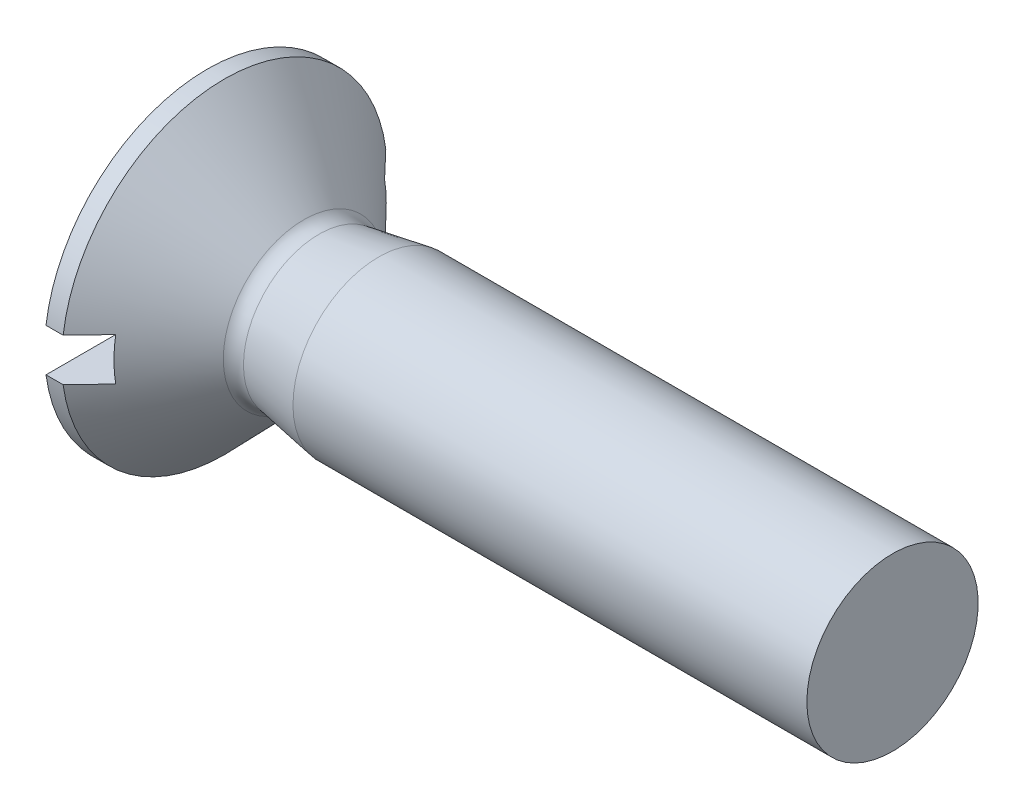
ISO-10303-21;
HEADER;
FILE_DESCRIPTION(('STEP AP214'),'2;1');
FILE_NAME('part.step','',(''),(''),'','','');
FILE_SCHEMA(('AUTOMOTIVE_DESIGN { 1 0 10303 214 1 1 1 1 }'));
ENDSEC;
DATA;
#1=APPLICATION_CONTEXT('core data for automotive mechanical design processes');
#2=APPLICATION_PROTOCOL_DEFINITION('international standard','automotive_design',2000,#1);
#3=PRODUCT_CONTEXT('',#1,'mechanical');
#4=PRODUCT('Part','Part','',(#3));
#5=PRODUCT_RELATED_PRODUCT_CATEGORY('part','',(#4));
#6=PRODUCT_DEFINITION_FORMATION('','',#4);
#7=PRODUCT_DEFINITION_CONTEXT('part definition',#1,'design');
#8=PRODUCT_DEFINITION('design','',#6,#7);
#9=PRODUCT_DEFINITION_SHAPE('','',#8);
#10=(LENGTH_UNIT() NAMED_UNIT(*) SI_UNIT(.MILLI.,.METRE.));
#11=(NAMED_UNIT(*) PLANE_ANGLE_UNIT() SI_UNIT($,.RADIAN.));
#12=(NAMED_UNIT(*) SI_UNIT($,.STERADIAN.) SOLID_ANGLE_UNIT());
#13=UNCERTAINTY_MEASURE_WITH_UNIT(LENGTH_MEASURE(1.E-05),#10,'distance_accuracy_value','');
#14=(GEOMETRIC_REPRESENTATION_CONTEXT(3) GLOBAL_UNCERTAINTY_ASSIGNED_CONTEXT((#13)) GLOBAL_UNIT_ASSIGNED_CONTEXT((#10,
#11,#12)) REPRESENTATION_CONTEXT('',''));
#15=CARTESIAN_POINT('',(0.,0.,0.));
#16=DIRECTION('',(0.,0.,1.));
#17=DIRECTION('',(1.,0.,0.));
#18=AXIS2_PLACEMENT_3D('',#15,#16,#17);
#19=CARTESIAN_POINT('',(0.,0.,0.));
#20=DIRECTION('',(-1.,0.,0.));
#21=DIRECTION('',(0.,0.,1.));
#22=AXIS2_PLACEMENT_3D('',#19,#20,#21);
#23=CYLINDRICAL_SURFACE('',#22,1.9);
#24=CARTESIAN_POINT('',(0.2,0.,0.));
#25=DIRECTION('',(-1.,0.,0.));
#26=DIRECTION('',(0.,0.,1.));
#27=AXIS2_PLACEMENT_3D('',#24,#25,#26);
#28=CIRCLE('',#27,1.9);
#29=CARTESIAN_POINT('',(0.2,-0.249999999999999,-1.88348082018374));
#30=VERTEX_POINT('',#29);
#31=CARTESIAN_POINT('',(0.2,-0.249999999999999,1.88348082018374));
#32=VERTEX_POINT('',#31);
#33=EDGE_CURVE('E105',#30,#32,#28,.T.);
#34=ORIENTED_EDGE('',*,*,#33,.T.);
#35=DIRECTION('',(-1.,0.,0.));
#36=VECTOR('',#35,1.);
#37=CARTESIAN_POINT('',(0.,-0.249999999999999,1.88348082018374));
#38=LINE('',#37,#36);
#39=CARTESIAN_POINT('',(0.,-0.249999999999999,1.88348082018374));
#40=VERTEX_POINT('',#39);
#41=EDGE_CURVE('E106',#32,#40,#38,.T.);
#42=ORIENTED_EDGE('',*,*,#41,.T.);
#43=CARTESIAN_POINT('',(0.,0.,0.));
#44=DIRECTION('',(-1.,0.,0.));
#45=DIRECTION('',(0.,0.,1.));
#46=AXIS2_PLACEMENT_3D('',#43,#44,#45);
#47=CIRCLE('',#46,1.9);
#48=CARTESIAN_POINT('',(0.,-0.249999999999999,-1.88348082018374));
#49=VERTEX_POINT('',#48);
#50=EDGE_CURVE('E167',#49,#40,#47,.T.);
#51=ORIENTED_EDGE('',*,*,#50,.F.);
#52=DIRECTION('',(-1.,0.,0.));
#53=VECTOR('',#52,1.);
#54=CARTESIAN_POINT('',(0.,-0.249999999999999,-1.88348082018374));
#55=LINE('',#54,#53);
#56=EDGE_CURVE('E50',#49,#30,#55,.F.);
#57=ORIENTED_EDGE('',*,*,#56,.T.);
#58=EDGE_LOOP('',(#34,#42,#51,#57));
#59=FACE_BOUND('',#58,.T.);
#60=ADVANCED_FACE('F35',(#59),#23,.T.);
#61=CARTESIAN_POINT('',(0.,0.,0.));
#62=DIRECTION('',(1.,0.,0.));
#63=DIRECTION('',(0.,0.,-1.));
#64=AXIS2_PLACEMENT_3D('',#61,#62,#63);
#65=PLANE('',#64);
#66=CARTESIAN_POINT('',(0.,0.25,1.88348082018374));
#67=VERTEX_POINT('',#66);
#68=CARTESIAN_POINT('',(0.,0.25,-1.88348082018374));
#69=VERTEX_POINT('',#68);
#70=EDGE_CURVE('E163',#67,#69,#47,.T.);
#71=ORIENTED_EDGE('',*,*,#70,.T.);
#72=DIRECTION('',(0.,0.,1.));
#73=VECTOR('',#72,1.);
#74=CARTESIAN_POINT('',(0.,0.25,0.));
#75=LINE('',#74,#73);
#76=EDGE_CURVE('E181',#69,#67,#75,.T.);
#77=ORIENTED_EDGE('',*,*,#76,.T.);
#78=EDGE_LOOP('',(#71,#77));
#79=FACE_BOUND('',#78,.T.);
#80=ADVANCED_FACE('F148',(#79),#65,.F.);
#81=CARTESIAN_POINT('',(8.,1.,0.));
#82=DIRECTION('',(-1.,0.,0.));
#83=DIRECTION('',(0.,0.,1.));
#84=AXIS2_PLACEMENT_3D('',#81,#82,#83);
#85=PLANE('',#84);
#86=CARTESIAN_POINT('',(8.,0.,0.));
#87=DIRECTION('',(-1.,0.,0.));
#88=DIRECTION('',(0.,0.,1.));
#89=AXIS2_PLACEMENT_3D('',#86,#87,#88);
#90=CIRCLE('',#89,1.);
#91=CARTESIAN_POINT('',(8.,0.,1.));
#92=VERTEX_POINT('',#91);
#93=EDGE_CURVE('E177',#92,#92,#90,.T.);
#94=ORIENTED_EDGE('',*,*,#93,.F.);
#95=EDGE_LOOP('',(#94));
#96=FACE_BOUND('',#95,.T.);
#97=ADVANCED_FACE('F37',(#96),#85,.F.);
#98=CARTESIAN_POINT('',(0.,0.,0.));
#99=DIRECTION('',(-1.,0.,0.));
#100=DIRECTION('',(0.,0.,1.));
#101=AXIS2_PLACEMENT_3D('',#98,#99,#100);
#102=CYLINDRICAL_SURFACE('',#101,1.);
#103=CARTESIAN_POINT('',(2.,0.,0.));
#104=DIRECTION('',(-1.,0.,0.));
#105=DIRECTION('',(0.,0.,1.));
#106=AXIS2_PLACEMENT_3D('',#103,#104,#105);
#107=CIRCLE('',#106,1.);
#108=CARTESIAN_POINT('',(2.,0.,1.));
#109=VERTEX_POINT('',#108);
#110=EDGE_CURVE('E174',#109,#109,#107,.T.);
#111=ORIENTED_EDGE('',*,*,#110,.F.);
#112=EDGE_LOOP('',(#111));
#113=FACE_BOUND('',#112,.T.);
#114=ORIENTED_EDGE('',*,*,#93,.T.);
#115=EDGE_LOOP('',(#114));
#116=FACE_BOUND('',#115,.T.);
#117=ADVANCED_FACE('F186',(#113,#116),#102,.T.);
#118=CARTESIAN_POINT('',(2.,0.,0.));
#119=DIRECTION('',(1.,0.,0.));
#120=DIRECTION('',(0.,0.,-1.));
#121=AXIS2_PLACEMENT_3D('',#118,#119,#120);
#122=CONICAL_SURFACE('',#121,1.,0.167819484919047);
#123=CARTESIAN_POINT('',(1.30400038848807,0.,0.));
#124=DIRECTION('',(-1.,0.,0.));
#125=DIRECTION('',(0.,0.,1.));
#126=AXIS2_PLACEMENT_3D('',#123,#124,#125);
#127=CIRCLE('',#126,0.882088692817089);
#128=CARTESIAN_POINT('',(1.30400038848807,0.,0.882088692817089));
#129=VERTEX_POINT('',#128);
#130=EDGE_CURVE('E171',#129,#129,#127,.T.);
#131=ORIENTED_EDGE('',*,*,#130,.F.);
#132=EDGE_LOOP('',(#131));
#133=FACE_BOUND('',#132,.T.);
#134=ORIENTED_EDGE('',*,*,#110,.T.);
#135=EDGE_LOOP('',(#134));
#136=FACE_BOUND('',#135,.T.);
#137=ADVANCED_FACE('F192',(#133,#136),#122,.T.);
#138=CARTESIAN_POINT('',(1.27059381526381,0.,0.));
#139=DIRECTION('',(-1.,0.,0.));
#140=DIRECTION('',(0.,0.,1.));
#141=AXIS2_PLACEMENT_3D('',#138,#139,#140);
#142=TOROIDAL_SURFACE('',#141,1.07927895846277,0.2);
#143=CARTESIAN_POINT('',(1.12672585519608,0.,0.));
#144=DIRECTION('',(-1.,0.,0.));
#145=DIRECTION('',(0.,0.,1.));
#146=AXIS2_PLACEMENT_3D('',#143,#144,#145);
#147=CIRCLE('',#146,0.940347284370966);
#148=CARTESIAN_POINT('',(1.12672585519608,0.,0.940347284370966));
#149=VERTEX_POINT('',#148);
#150=EDGE_CURVE('E165',#149,#149,#147,.T.);
#151=ORIENTED_EDGE('',*,*,#150,.F.);
#152=EDGE_LOOP('',(#151));
#153=FACE_BOUND('',#152,.T.);
#154=ORIENTED_EDGE('',*,*,#130,.T.);
#155=EDGE_LOOP('',(#154));
#156=FACE_BOUND('',#155,.T.);
#157=ADVANCED_FACE('F153',(#153,#156),#142,.F.);
#158=CARTESIAN_POINT('',(1.12672585519608,0.,0.));
#159=DIRECTION('',(-1.,0.,0.));
#160=DIRECTION('',(0.,0.,1.));
#161=AXIS2_PLACEMENT_3D('',#158,#159,#160);
#162=CONICAL_SURFACE('',#161,0.940347284370966,0.802851455917393);
#163=CARTESIAN_POINT('',(0.5,0.,0.));
#164=DIRECTION('',(1.,0.,0.));
#165=DIRECTION('',(0.,1.,0.));
#166=AXIS2_PLACEMENT_3D('',#163,#164,#165);
#167=CIRCLE('',#166,1.58934090586283);
#168=CARTESIAN_POINT('',(0.499999999999999,-0.249999999999999,-1.56955551512168));
#169=VERTEX_POINT('',#168);
#170=CARTESIAN_POINT('',(0.5,0.25,-1.56955551512168));
#171=VERTEX_POINT('',#170);
#172=EDGE_CURVE('E11',#169,#171,#167,.T.);
#173=ORIENTED_EDGE('',*,*,#172,.T.);
#174=CARTESIAN_POINT('',(-2.01601493470514,0.25,4.18729422630551));
#175=CARTESIAN_POINT('',(-1.87664923813912,0.25,4.04271769435418));
#176=CARTESIAN_POINT('',(-1.73729482345771,0.25,3.89813027800257));
#177=CARTESIAN_POINT('',(-1.45862095611518,0.25,3.6089169222469));
#178=CARTESIAN_POINT('',(-1.31930150410232,0.25,3.46429098221823));
#179=CARTESIAN_POINT('',(-1.04066177400944,0.25,3.17493377785335));
#180=CARTESIAN_POINT('',(-0.901341515801131,0.25,3.03020249438092));
#181=CARTESIAN_POINT('',(-0.622782490908927,0.25,2.74066622374668));
#182=CARTESIAN_POINT('',(-0.483543722883639,0.25,2.59586123787586));
#183=CARTESIAN_POINT('',(-0.201786956770368,0.25,2.30257938996187));
#184=CARTESIAN_POINT('',(-0.0592721606083867,0.25,2.15409945232285));
#185=CARTESIAN_POINT('',(0.225528245293348,0.25,1.85690533383418));
#186=CARTESIAN_POINT('',(0.367813843219135,0.25,1.70819114164504));
#187=CARTESIAN_POINT('',(0.580840870368113,0.25,1.48477213973957));
#188=CARTESIAN_POINT('',(0.651774267846905,0.25,1.41025039178459));
#189=CARTESIAN_POINT('',(0.793437145184127,0.25,1.26100995422566));
#190=CARTESIAN_POINT('',(0.864166620773327,0.25,1.18629126056032));
#191=CARTESIAN_POINT('',(1.00526448587424,0.25,1.03652726934552));
#192=CARTESIAN_POINT('',(1.0756329084935,0.25,0.961482002951812));
#193=CARTESIAN_POINT('',(1.21571782760126,0.25,0.810786132033253));
#194=CARTESIAN_POINT('',(1.28543435354055,0.25,0.735135555143891));
#195=CARTESIAN_POINT('',(1.37201750361893,0.25,0.639224449765212));
#196=CARTESIAN_POINT('',(1.3896160368168,0.25,0.619626583408543));
#197=CARTESIAN_POINT('',(1.4246691063127,0.25,0.580302510321601));
#198=CARTESIAN_POINT('',(1.44212364034506,0.25,0.560576301580701));
#199=CARTESIAN_POINT('',(1.49415371529718,0.25,0.501229712885388));
#200=CARTESIAN_POINT('',(1.52846095809073,0.25,0.461369657393176));
#201=CARTESIAN_POINT('',(1.58507933062902,0.25,0.393169607703334));
#202=CARTESIAN_POINT('',(1.6077717062677,0.25,0.365146567609488));
#203=CARTESIAN_POINT('',(1.65204449781809,0.25,0.308059026538506));
#204=CARTESIAN_POINT('',(1.67362100490673,0.25,0.278991399183496));
#205=CARTESIAN_POINT('',(1.71123114196319,0.25,0.22382616683357));
#206=CARTESIAN_POINT('',(1.7276061907623,0.25,0.197963111679399));
#207=CARTESIAN_POINT('',(1.75686731149356,0.25,0.144317811970711));
#208=CARTESIAN_POINT('',(1.7697727012953,0.25,0.116547322101303));
#209=CARTESIAN_POINT('',(1.78402855567211,0.25,0.0717983577731039));
#210=CARTESIAN_POINT('',(1.78796430954531,0.25,0.0556898048400385));
#211=CARTESIAN_POINT('',(1.79285666778232,0.25,0.0230595466848579));
#212=CARTESIAN_POINT('',(1.79382503824804,0.25,0.00653973572952782));
#213=CARTESIAN_POINT('',(1.79256779412007,0.25,-0.0263838004625423));
#214=CARTESIAN_POINT('',(1.79033915987774,0.25,-0.0427874012241021));
#215=CARTESIAN_POINT('',(1.78320931283225,0.25,-0.0750341288284093));
#216=CARTESIAN_POINT('',(1.77829704417356,0.25,-0.0908746463961853));
#217=CARTESIAN_POINT('',(1.76508659022058,0.25,-0.125837594435742));
#218=CARTESIAN_POINT('',(1.75624048953288,0.25,-0.144744602097832));
#219=CARTESIAN_POINT('',(1.73676775330008,0.25,-0.181635353658967));
#220=CARTESIAN_POINT('',(1.7261367353416,0.25,-0.199616679221351));
#221=CARTESIAN_POINT('',(1.70370123401058,0.25,-0.235033462765642));
#222=CARTESIAN_POINT('',(1.69188762334596,0.25,-0.252463049377781));
#223=CARTESIAN_POINT('',(1.66757081663527,0.25,-0.286795734849196));
#224=CARTESIAN_POINT('',(1.65506848487411,0.25,-0.303699453722596));
#225=CARTESIAN_POINT('',(1.61333324317185,0.25,-0.358538111769461));
#226=CARTESIAN_POINT('',(1.58314156582687,0.25,-0.395737930365852));
#227=CARTESIAN_POINT('',(1.5216698640317,0.25,-0.469231644734777));
#228=CARTESIAN_POINT('',(1.49038935658736,0.25,-0.505525125882915));
#229=CARTESIAN_POINT('',(1.42717306094644,0.25,-0.577627630223686));
#230=CARTESIAN_POINT('',(1.39523641414764,0.25,-0.613435901438079));
#231=CARTESIAN_POINT('',(1.33100167337737,0.25,-0.684711577002231));
#232=CARTESIAN_POINT('',(1.29870365403241,0.25,-0.720179049017128));
#233=CARTESIAN_POINT('',(1.20187883299638,0.25,-0.825799529881122));
#234=CARTESIAN_POINT('',(1.13700638296127,0.25,-0.895635369316581));
#235=CARTESIAN_POINT('',(1.00686288225263,0.25,-1.03483505375393));
#236=CARTESIAN_POINT('',(0.941592163859256,0.25,-1.10419921112329));
#237=CARTESIAN_POINT('',(0.757331369017412,0.25,-1.29930120353699));
#238=CARTESIAN_POINT('',(0.638050216922742,0.25,-1.4247640699768));
#239=CARTESIAN_POINT('',(0.399132142423295,0.25,-1.67535206962172));
#240=CARTESIAN_POINT('',(0.279495216130276,0.25,-1.800477199107));
#241=CARTESIAN_POINT('',(0.039982480864666,0.25,-2.05058314132827));
#242=CARTESIAN_POINT('',(-0.0798933973540164,0.25,-2.17556388778698));
#243=CARTESIAN_POINT('',(-0.319760521210998,0.25,-2.42541358736704));
#244=CARTESIAN_POINT('',(-0.439751766391554,0.25,-2.5502825409282));
#245=CARTESIAN_POINT('',(-0.802330817180014,0.25,-2.92738586690317));
#246=CARTESIAN_POINT('',(-1.04502811394854,0.25,-3.1795149529747));
#247=CARTESIAN_POINT('',(-1.53048563082897,0.25,-3.68353034814328));
#248=CARTESIAN_POINT('',(-1.77324579322125,0.25,-3.93541671282475));
#249=CARTESIAN_POINT('',(-2.01601493470514,0.25,-4.18729422630551));
#250=B_SPLINE_CURVE_WITH_KNOTS('',3,(#174,#175,#176,#177,#178,#179,#180,#181,#182,#183,#184,
#185,#186,#187,#188,#189,#190,#191,#192,#193,#194,#195,#196,#197,#198,#199,#200,#201,#202,#203,
#204,#205,#206,#207,#208,#209,#210,#211,#212,#213,#214,#215,#216,#217,#218,#219,#220,#221,#222,
#223,#224,#225,#226,#227,#228,#229,#230,#231,#232,#233,#234,#235,#236,#237,#238,#239,#240,#241,
#242,#243,#244,#245,#246,#247,#248,#249),.UNSPECIFIED.,.F.,.F.,(4,2,2,2,2,2,2,2,2,2,2,2,2,2,2,2,
2,2,2,2,2,2,2,2,2,2,2,2,2,2,2,2,2,2,2,2,2,4),(0.,0.602433856000322,1.20487816004374,
1.80755178193664,2.4102151874483,3.02763789002436,3.64509145957526,3.95374218183071,
4.26239931962769,4.57102762963268,4.87964192868944,4.95866046545058,5.0376802431197,
5.19542898182686,5.30359549595027,5.41211829389888,5.50388214281981,5.5951239734863,
5.64465557396231,5.69399051870495,5.74337209219491,5.79295865572406,5.85541669420085,
5.91803038729474,5.98117131376421,6.04423473310871,6.18790584613683,6.33164152340159,
6.47557906854842,6.61948741872571,6.9054352760994,7.19117049681672,7.71051404804738,
8.22986329617977,8.74939529776958,9.26892524644334,10.3188010616788,11.3682831989146),.UNSPECIFIED.);
#251=CARTESIAN_POINT('',(0.2,0.25,-1.88348082018374));
#252=VERTEX_POINT('',#251);
#253=EDGE_CURVE('E126',#171,#252,#250,.T.);
#254=ORIENTED_EDGE('',*,*,#253,.T.);
#255=CARTESIAN_POINT('',(0.2,0.25,1.88348082018374));
#256=VERTEX_POINT('',#255);
#257=EDGE_CURVE('E162',#256,#252,#28,.T.);
#258=ORIENTED_EDGE('',*,*,#257,.F.);
#259=CARTESIAN_POINT('',(0.5,0.25,1.56955551512168));
#260=VERTEX_POINT('',#259);
#261=EDGE_CURVE('E118',#256,#260,#250,.T.);
#262=ORIENTED_EDGE('',*,*,#261,.T.);
#263=CARTESIAN_POINT('',(0.499999999999999,-0.249999999999999,1.56955551512168));
#264=VERTEX_POINT('',#263);
#265=EDGE_CURVE('E39',#260,#264,#167,.T.);
#266=ORIENTED_EDGE('',*,*,#265,.T.);
#267=CARTESIAN_POINT('',(-2.01601493470514,-0.249999999999999,-4.18729422630551));
#268=CARTESIAN_POINT('',(-1.87664923813912,-0.249999999999999,-4.04271769435418));
#269=CARTESIAN_POINT('',(-1.73729482345771,-0.249999999999999,-3.89813027800256));
#270=CARTESIAN_POINT('',(-1.45862095611517,-0.249999999999999,-3.60891692224689));
#271=CARTESIAN_POINT('',(-1.31930150410231,-0.249999999999999,-3.46429098221822));
#272=CARTESIAN_POINT('',(-1.04066177400943,-0.249999999999999,-3.17493377785335));
#273=CARTESIAN_POINT('',(-0.901341515801126,-0.249999999999999,-3.03020249438091));
#274=CARTESIAN_POINT('',(-0.622782490908921,-0.249999999999999,-2.74066622374667));
#275=CARTESIAN_POINT('',(-0.483543722883633,-0.249999999999999,-2.59586123787585));
#276=CARTESIAN_POINT('',(-0.201786956770361,-0.249999999999999,-2.30257938996186));
#277=CARTESIAN_POINT('',(-0.0592721606083805,-0.249999999999999,-2.15409945232285));
#278=CARTESIAN_POINT('',(0.225528245293354,-0.249999999999999,-1.85690533383417));
#279=CARTESIAN_POINT('',(0.36781384321914,-0.249999999999999,-1.70819114164503));
#280=CARTESIAN_POINT('',(0.580840870368117,-0.249999999999999,-1.48477213973956));
#281=CARTESIAN_POINT('',(0.651774267846908,-0.249999999999999,-1.41025039178459));
#282=CARTESIAN_POINT('',(0.79343714518413,-0.249999999999999,-1.26100995422566));
#283=CARTESIAN_POINT('',(0.864166620773329,-0.249999999999999,-1.18629126056031));
#284=CARTESIAN_POINT('',(1.00526448587424,-0.249999999999999,-1.03652726934552));
#285=CARTESIAN_POINT('',(1.0756329084935,-0.249999999999999,-0.96148200295181));
#286=CARTESIAN_POINT('',(1.21571782760126,-0.249999999999999,-0.810786132033252));
#287=CARTESIAN_POINT('',(1.28543435354056,-0.249999999999999,-0.735135555143891));
#288=CARTESIAN_POINT('',(1.37201750361893,-0.249999999999999,-0.639224449765212));
#289=CARTESIAN_POINT('',(1.3896160368168,-0.249999999999999,-0.619626583408544));
#290=CARTESIAN_POINT('',(1.4246691063127,-0.249999999999999,-0.580302510321601));
#291=CARTESIAN_POINT('',(1.44212364034506,-0.249999999999999,-0.560576301580701));
#292=CARTESIAN_POINT('',(1.49415371529718,-0.249999999999999,-0.501229712885388));
#293=CARTESIAN_POINT('',(1.52846095809073,-0.249999999999999,-0.461369657393176));
#294=CARTESIAN_POINT('',(1.58507933062902,-0.249999999999999,-0.393169607703335));
#295=CARTESIAN_POINT('',(1.6077717062677,-0.249999999999999,-0.365146567609488));
#296=CARTESIAN_POINT('',(1.65204449781809,-0.249999999999999,-0.308059026538507));
#297=CARTESIAN_POINT('',(1.67362100490673,-0.249999999999999,-0.278991399183497));
#298=CARTESIAN_POINT('',(1.71123114196319,-0.249999999999999,-0.223826166833571));
#299=CARTESIAN_POINT('',(1.7276061907623,-0.249999999999999,-0.1979631116794));
#300=CARTESIAN_POINT('',(1.75686731149356,-0.249999999999999,-0.144317811970711));
#301=CARTESIAN_POINT('',(1.7697727012953,-0.249999999999999,-0.116547322101302));
#302=CARTESIAN_POINT('',(1.78402855567211,-0.249999999999999,-0.0717983577731018));
#303=CARTESIAN_POINT('',(1.78796430954531,-0.249999999999999,-0.0556898048400362));
#304=CARTESIAN_POINT('',(1.79285666778232,-0.249999999999999,-0.0230595466848554));
#305=CARTESIAN_POINT('',(1.79382503824804,-0.249999999999999,-0.00653973572952537));
#306=CARTESIAN_POINT('',(1.79256779412007,-0.249999999999999,0.0263838004625447));
#307=CARTESIAN_POINT('',(1.79033915987774,-0.249999999999999,0.0427874012241046));
#308=CARTESIAN_POINT('',(1.78320931283225,-0.249999999999999,0.0750341288284119));
#309=CARTESIAN_POINT('',(1.77829704417356,-0.249999999999999,0.0908746463961878));
#310=CARTESIAN_POINT('',(1.76508659022058,-0.249999999999999,0.125837594435745));
#311=CARTESIAN_POINT('',(1.75624048953288,-0.249999999999999,0.144744602097835));
#312=CARTESIAN_POINT('',(1.73676775330008,-0.249999999999999,0.181635353658971));
#313=CARTESIAN_POINT('',(1.7261367353416,-0.249999999999999,0.199616679221356));
#314=CARTESIAN_POINT('',(1.70370123401058,-0.249999999999999,0.235033462765648));
#315=CARTESIAN_POINT('',(1.69188762334596,-0.249999999999999,0.252463049377787));
#316=CARTESIAN_POINT('',(1.66757081663526,-0.249999999999999,0.286795734849203));
#317=CARTESIAN_POINT('',(1.65506848487411,-0.249999999999999,0.303699453722604));
#318=CARTESIAN_POINT('',(1.61333324317184,-0.249999999999999,0.35853811176947));
#319=CARTESIAN_POINT('',(1.58314156582686,-0.249999999999999,0.395737930365863));
#320=CARTESIAN_POINT('',(1.52166986403169,-0.249999999999999,0.46923164473479));
#321=CARTESIAN_POINT('',(1.49038935658735,-0.249999999999999,0.505525125882929));
#322=CARTESIAN_POINT('',(1.42717306094642,-0.249999999999999,0.577627630223703));
#323=CARTESIAN_POINT('',(1.39523641414762,-0.249999999999999,0.613435901438098));
#324=CARTESIAN_POINT('',(1.33100167337735,-0.249999999999999,0.684711577002252));
#325=CARTESIAN_POINT('',(1.29870365403239,-0.249999999999999,0.720179049017151));
#326=CARTESIAN_POINT('',(1.20187883299635,-0.249999999999999,0.825799529881149));
#327=CARTESIAN_POINT('',(1.13700638296124,-0.249999999999999,0.89563536931661));
#328=CARTESIAN_POINT('',(1.0068628822526,-0.249999999999999,1.03483505375397));
#329=CARTESIAN_POINT('',(0.941592163859221,-0.249999999999999,1.10419921112333));
#330=CARTESIAN_POINT('',(0.757331369017376,-0.249999999999999,1.29930120353703));
#331=CARTESIAN_POINT('',(0.638050216922707,-0.249999999999999,1.42476406997683));
#332=CARTESIAN_POINT('',(0.399132142423264,-0.249999999999999,1.67535206962175));
#333=CARTESIAN_POINT('',(0.279495216130247,-0.249999999999999,1.80047719910703));
#334=CARTESIAN_POINT('',(0.03998248086464,-0.249999999999999,2.0505831413283));
#335=CARTESIAN_POINT('',(-0.0798933973540407,-0.249999999999999,2.175563887787));
#336=CARTESIAN_POINT('',(-0.319760521211019,-0.249999999999999,2.42541358736707));
#337=CARTESIAN_POINT('',(-0.439751766391573,-0.249999999999999,2.55028254092822));
#338=CARTESIAN_POINT('',(-0.802330817180028,-0.249999999999999,2.92738586690319));
#339=CARTESIAN_POINT('',(-1.04502811394855,-0.249999999999999,3.17951495297471));
#340=CARTESIAN_POINT('',(-1.53048563082898,-0.249999999999999,3.68353034814329));
#341=CARTESIAN_POINT('',(-1.77324579322125,-0.249999999999999,3.93541671282475));
#342=CARTESIAN_POINT('',(-2.01601493470514,-0.249999999999999,4.18729422630551));
#343=B_SPLINE_CURVE_WITH_KNOTS('',3,(#267,#268,#269,#270,#271,#272,#273,#274,#275,#276,#277,
#278,#279,#280,#281,#282,#283,#284,#285,#286,#287,#288,#289,#290,#291,#292,#293,#294,#295,#296,
#297,#298,#299,#300,#301,#302,#303,#304,#305,#306,#307,#308,#309,#310,#311,#312,#313,#314,#315,
#316,#317,#318,#319,#320,#321,#322,#323,#324,#325,#326,#327,#328,#329,#330,#331,#332,#333,#334,
#335,#336,#337,#338,#339,#340,#341,#342),.UNSPECIFIED.,.F.,.F.,(4,2,2,2,2,2,2,2,2,2,2,2,2,2,2,2,
2,2,2,2,2,2,2,2,2,2,2,2,2,2,2,2,2,2,2,2,2,4),(0.,0.602433856000326,1.20487816004375,
1.80755178193665,2.41021518744831,3.02763789002436,3.64509145957526,3.95374218183072,
4.26239931962769,4.57102762963268,4.87964192868944,4.95866046545058,5.0376802431197,
5.19542898182685,5.30359549595027,5.41211829389888,5.50388214281981,5.5951239734863,
5.64465557396231,5.69399051870495,5.74337209219491,5.79295865572406,5.85541669420086,
5.91803038729475,5.98117131376422,6.04423473310872,6.18790584613684,6.3316415234016,
6.47557906854845,6.61948741872574,6.90543527609944,7.19117049681677,7.71051404804743,
8.22986329617981,8.74939529776961,9.26892524644336,10.3188010616788,11.3682831989146),.UNSPECIFIED.);
#344=EDGE_CURVE('E99',#264,#32,#343,.T.);
#345=ORIENTED_EDGE('',*,*,#344,.T.);
#346=ORIENTED_EDGE('',*,*,#33,.F.);
#347=EDGE_CURVE('E97',#30,#169,#343,.T.);
#348=ORIENTED_EDGE('',*,*,#347,.T.);
#349=EDGE_LOOP('',(#173,#254,#258,#262,#266,#345,#346,#348));
#350=FACE_BOUND('',#349,.T.);
#351=ORIENTED_EDGE('',*,*,#150,.T.);
#352=EDGE_LOOP('',(#351));
#353=FACE_BOUND('',#352,.T.);
#354=ADVANCED_FACE('F102',(#350,#353),#162,.T.);
#355=ORIENTED_EDGE('',*,*,#257,.T.);
#356=DIRECTION('',(-1.,0.,0.));
#357=VECTOR('',#356,1.);
#358=CARTESIAN_POINT('',(0.,0.25,-1.88348082018374));
#359=LINE('',#358,#357);
#360=EDGE_CURVE('E58',#252,#69,#359,.T.);
#361=ORIENTED_EDGE('',*,*,#360,.T.);
#362=ORIENTED_EDGE('',*,*,#70,.F.);
#363=DIRECTION('',(-1.,0.,0.));
#364=VECTOR('',#363,1.);
#365=CARTESIAN_POINT('',(0.,0.25,1.88348082018374));
#366=LINE('',#365,#364);
#367=EDGE_CURVE('E116',#67,#256,#366,.F.);
#368=ORIENTED_EDGE('',*,*,#367,.T.);
#369=EDGE_LOOP('',(#355,#361,#362,#368));
#370=FACE_BOUND('',#369,.T.);
#371=ADVANCED_FACE('F146',(#370),#23,.T.);
#372=ORIENTED_EDGE('',*,*,#50,.T.);
#373=DIRECTION('',(0.,0.,-1.));
#374=VECTOR('',#373,1.);
#375=CARTESIAN_POINT('',(0.,-0.249999999999999,0.));
#376=LINE('',#375,#374);
#377=EDGE_CURVE('E180',#40,#49,#376,.T.);
#378=ORIENTED_EDGE('',*,*,#377,.T.);
#379=EDGE_LOOP('',(#372,#378));
#380=FACE_BOUND('',#379,.T.);
#381=ADVANCED_FACE('F141',(#380),#65,.F.);
#382=CARTESIAN_POINT('',(0.5,0.25,-1.9));
#383=DIRECTION('',(1.,0.,0.));
#384=DIRECTION('',(0.,1.,0.));
#385=AXIS2_PLACEMENT_3D('',#382,#383,#384);
#386=PLANE('',#385);
#387=DIRECTION('',(0.,0.,1.));
#388=VECTOR('',#387,1.);
#389=CARTESIAN_POINT('',(0.5,0.25,-1.9));
#390=LINE('',#389,#388);
#391=EDGE_CURVE('E93',#171,#260,#390,.T.);
#392=ORIENTED_EDGE('',*,*,#391,.F.);
#393=ORIENTED_EDGE('',*,*,#172,.F.);
#394=DIRECTION('',(0.,0.,1.));
#395=VECTOR('',#394,1.);
#396=CARTESIAN_POINT('',(0.499999999999999,-0.249999999999999,-1.9));
#397=LINE('',#396,#395);
#398=EDGE_CURVE('E90',#169,#264,#397,.T.);
#399=ORIENTED_EDGE('',*,*,#398,.T.);
#400=ORIENTED_EDGE('',*,*,#265,.F.);
#401=EDGE_LOOP('',(#392,#393,#399,#400));
#402=FACE_BOUND('',#401,.T.);
#403=ADVANCED_FACE('F89',(#402),#386,.F.);
#404=CARTESIAN_POINT('',(0.,0.25,-1.9));
#405=DIRECTION('',(0.,1.,0.));
#406=DIRECTION('',(0.,0.,1.));
#407=AXIS2_PLACEMENT_3D('',#404,#405,#406);
#408=PLANE('',#407);
#409=ORIENTED_EDGE('',*,*,#391,.T.);
#410=ORIENTED_EDGE('',*,*,#261,.F.);
#411=ORIENTED_EDGE('',*,*,#367,.F.);
#412=ORIENTED_EDGE('',*,*,#76,.F.);
#413=ORIENTED_EDGE('',*,*,#360,.F.);
#414=ORIENTED_EDGE('',*,*,#253,.F.);
#415=EDGE_LOOP('',(#409,#410,#411,#412,#413,#414));
#416=FACE_BOUND('',#415,.T.);
#417=ADVANCED_FACE('F136',(#416),#408,.F.);
#418=CARTESIAN_POINT('',(0.,-0.249999999999999,-1.9));
#419=DIRECTION('',(0.,-1.,0.));
#420=DIRECTION('',(0.,0.,-1.));
#421=AXIS2_PLACEMENT_3D('',#418,#419,#420);
#422=PLANE('',#421);
#423=ORIENTED_EDGE('',*,*,#398,.F.);
#424=ORIENTED_EDGE('',*,*,#347,.F.);
#425=ORIENTED_EDGE('',*,*,#56,.F.);
#426=ORIENTED_EDGE('',*,*,#377,.F.);
#427=ORIENTED_EDGE('',*,*,#41,.F.);
#428=ORIENTED_EDGE('',*,*,#344,.F.);
#429=EDGE_LOOP('',(#423,#424,#425,#426,#427,#428));
#430=FACE_BOUND('',#429,.T.);
#431=ADVANCED_FACE('F96',(#430),#422,.F.);
#432=CLOSED_SHELL('',(#60,#80,#97,#117,#137,#157,#354,#371,#381,#403,#417,#431));
#433=MANIFOLD_SOLID_BREP('B2',#432);
#434=ADVANCED_BREP_SHAPE_REPRESENTATION('',(#18,#433),#14);
#435=SHAPE_DEFINITION_REPRESENTATION(#9,#434);
ENDSEC;
END-ISO-10303-21;
